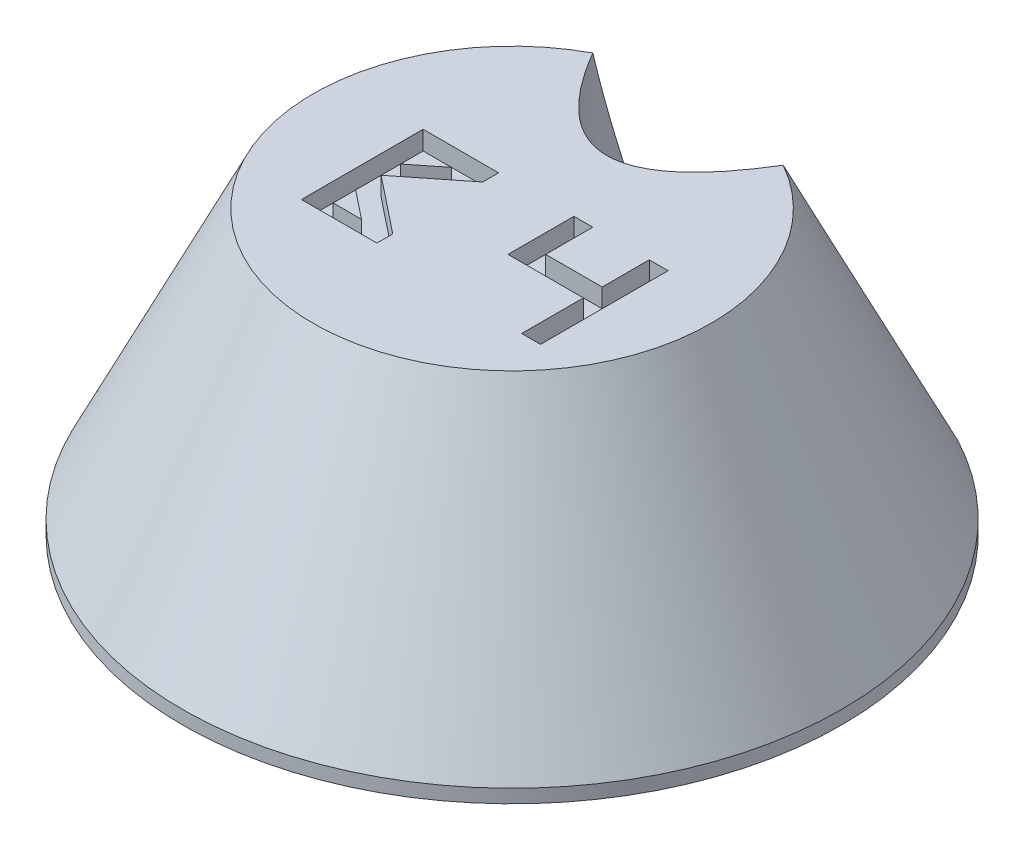
ISO-10303-21;
HEADER;
FILE_DESCRIPTION(('STEP AP214'),'2;1');
FILE_NAME('part.step','',(''),(''),'','','');
FILE_SCHEMA(('AUTOMOTIVE_DESIGN { 1 0 10303 214 1 1 1 1 }'));
ENDSEC;
DATA;
#1=APPLICATION_CONTEXT('core data for automotive mechanical design processes');
#2=APPLICATION_PROTOCOL_DEFINITION('international standard','automotive_design',2000,#1);
#3=PRODUCT_CONTEXT('',#1,'mechanical');
#4=PRODUCT('Part','Part','',(#3));
#5=PRODUCT_RELATED_PRODUCT_CATEGORY('part','',(#4));
#6=PRODUCT_DEFINITION_FORMATION('','',#4);
#7=PRODUCT_DEFINITION_CONTEXT('part definition',#1,'design');
#8=PRODUCT_DEFINITION('design','',#6,#7);
#9=PRODUCT_DEFINITION_SHAPE('','',#8);
#10=(LENGTH_UNIT() NAMED_UNIT(*) SI_UNIT(.MILLI.,.METRE.));
#11=(NAMED_UNIT(*) PLANE_ANGLE_UNIT() SI_UNIT($,.RADIAN.));
#12=(NAMED_UNIT(*) SI_UNIT($,.STERADIAN.) SOLID_ANGLE_UNIT());
#13=UNCERTAINTY_MEASURE_WITH_UNIT(LENGTH_MEASURE(1.E-05),#10,'distance_accuracy_value','');
#14=(GEOMETRIC_REPRESENTATION_CONTEXT(3) GLOBAL_UNCERTAINTY_ASSIGNED_CONTEXT((#13)) GLOBAL_UNIT_ASSIGNED_CONTEXT((#10,
#11,#12)) REPRESENTATION_CONTEXT('',''));
#15=CARTESIAN_POINT('',(0.,0.,0.));
#16=DIRECTION('',(0.,0.,1.));
#17=DIRECTION('',(1.,0.,0.));
#18=AXIS2_PLACEMENT_3D('',#15,#16,#17);
#19=CARTESIAN_POINT('',(8.18669170039506,15.,-15.4669996768178));
#20=CARTESIAN_POINT('',(-0.0591714163028373,15.,5.64885572999055));
#21=CARTESIAN_POINT('',(-7.8608991487024,15.,-15.6350972038529));
#22=B_SPLINE_CURVE_WITH_KNOTS('',2,(#19,#20,#21),.UNSPECIFIED.,.F.,.F.,(3,3),(0.,1.),.UNSPECIFIED.);
#23=DIRECTION('',(0.,-1.,0.));
#24=VECTOR('',#23,1.);
#25=SURFACE_OF_LINEAR_EXTRUSION('',#22,#24);
#26=CARTESIAN_POINT('',(-5.0098597989028,15.,-9.29821766200558));
#27=CARTESIAN_POINT('',(-5.07414422699931,14.7365281878771,-9.40894640558933));
#28=CARTESIAN_POINT('',(-5.13748485824235,14.4730441513829,-9.52018929222185));
#29=CARTESIAN_POINT('',(-5.26241635776587,13.9460659233518,-9.74362380865663));
#30=CARTESIAN_POINT('',(-5.32400724003735,13.682571731913,-9.85581543086348));
#31=CARTESIAN_POINT('',(-5.50635046744444,12.8921456425735,-10.1936725658184));
#32=CARTESIAN_POINT('',(-5.62468714212551,12.3652136301595,-10.4206441654586));
#33=CARTESIAN_POINT('',(-5.8557821905037,11.311426682589,-10.877540915263));
#34=CARTESIAN_POINT('',(-5.96854068442593,10.7845717460156,-11.1074660016367));
#35=CARTESIAN_POINT('',(-6.18911815550837,9.73115893426602,-11.5697626583082));
#36=CARTESIAN_POINT('',(-6.29693905529791,9.20460102368833,-11.8021332322681));
#37=CARTESIAN_POINT('',(-6.50824052110613,8.15157354006544,-12.2690676680501));
#38=CARTESIAN_POINT('',(-6.61172098512707,7.62510396938541,-12.5036315812561));
#39=CARTESIAN_POINT('',(-6.81479189522224,6.57226462240257,-12.9746601266114));
#40=CARTESIAN_POINT('',(-6.91438233339698,6.04589484630456,-13.2111247626193));
#41=CARTESIAN_POINT('',(-7.08663878740599,5.11920209503159,-13.628929150555));
#42=CARTESIAN_POINT('',(-7.16004479105935,4.71885860408437,-13.8099191742655));
#43=CARTESIAN_POINT('',(-7.30496649692964,3.91822939055515,-14.1727677090721));
#44=CARTESIAN_POINT('',(-7.37648222304347,3.51794366730654,-14.3546262091546));
#45=CARTESIAN_POINT('',(-7.51776759341717,2.71734004168838,-14.7191705229043));
#46=CARTESIAN_POINT('',(-7.58753687860065,2.31702214940516,-14.9018564977326));
#47=CARTESIAN_POINT('',(-7.72542676972131,1.51642804998791,-15.2679519216616));
#48=CARTESIAN_POINT('',(-7.79354735873456,1.11615184332374,-15.4513613781665));
#49=CARTESIAN_POINT('',(-7.8608991487024,0.715896693708777,-15.6350972038529));
#50=B_SPLINE_CURVE_WITH_KNOTS('',3,(#26,#27,#28,#29,#30,#31,#32,#33,#34,#35,#36,#37,#38,#39,#40,
#41,#42,#43,#44,#45,#46,#47,#48,#49),.UNSPECIFIED.,.F.,.F.,(4,2,2,2,2,2,2,2,2,2,2,4),(0.,
0.878799230708949,1.75759143255399,3.51498706846908,5.27234481116441,7.02901234167528,
8.78572112976651,10.5424334850327,11.8787619651716,13.2150735433558,14.551657653461,
15.8882554778523),.UNSPECIFIED.);
#51=CARTESIAN_POINT('',(-5.00985979890272,15.,-9.29821766200562));
#52=VERTEX_POINT('',#51);
#53=CARTESIAN_POINT('',(-7.8608991487024,0.715896693708777,-15.6350972038529));
#54=VERTEX_POINT('',#53);
#55=EDGE_CURVE('E492',#52,#54,#50,.T.);
#56=ORIENTED_EDGE('',*,*,#55,.F.);
#57=CARTESIAN_POINT('',(5.20353565699155,15.,-9.19123297284496));
#58=VERTEX_POINT('',#57);
#59=EDGE_CURVE('E538',#58,#52,#22,.T.);
#60=ORIENTED_EDGE('',*,*,#59,.F.);
#61=CARTESIAN_POINT('',(8.18669170039506,0.715896693708772,-15.4669996768178));
#62=CARTESIAN_POINT('',(8.10204818368061,1.19180990978793,-15.2502600316679));
#63=CARTESIAN_POINT('',(8.01633023885184,1.66775295008861,-15.0340026007232));
#64=CARTESIAN_POINT('',(7.84257005638052,2.61962131373132,-14.6026134017948));
#65=CARTESIAN_POINT('',(7.75452822889522,3.09554662554863,-14.3874814430946));
#66=CARTESIAN_POINT('',(7.57592886624524,4.04739672904643,-13.9584609297913));
#67=CARTESIAN_POINT('',(7.48537171535659,4.52332150981847,-13.7445721912288));
#68=CARTESIAN_POINT('',(7.3015144718489,5.47519061877045,-13.3181792758052));
#69=CARTESIAN_POINT('',(7.20821471309991,5.95113493758554,-13.1056749342314));
#70=CARTESIAN_POINT('',(7.01861055034016,6.90306652612799,-12.6822132865355));
#71=CARTESIAN_POINT('',(6.92230638966266,7.37905378927969,-12.4712558568261));
#72=CARTESIAN_POINT('',(6.72637390164977,8.3311556228556,-12.0510528752218));
#73=CARTESIAN_POINT('',(6.62674526541675,8.80727020100939,-11.8418074846651));
#74=CARTESIAN_POINT('',(6.42381233924976,9.75959112828457,-11.4252811289792));
#75=CARTESIAN_POINT('',(6.32050795985689,10.2357974793586,-11.2180002118162));
#76=CARTESIAN_POINT('',(6.10978444245751,11.188319486263,-10.8056747961175));
#77=CARTESIAN_POINT('',(6.00236495501761,11.6646351479467,-10.6006304894107));
#78=CARTESIAN_POINT('',(5.78288653496701,12.6173960379511,-10.1930946596617));
#79=CARTESIAN_POINT('',(5.67082679968787,13.0938412744059,-9.99060358624609));
#80=CARTESIAN_POINT('',(5.44135910215429,14.0468682643725,-9.58857748268586));
#81=CARTESIAN_POINT('',(5.32394952441522,14.5234500153549,-9.38904336987994));
#82=CARTESIAN_POINT('',(5.20353565699155,15.,-9.19123297284496));
#83=B_SPLINE_CURVE_WITH_KNOTS('',3,(#61,#62,#63,#64,#65,#66,#67,#68,#69,#70,#71,#72,#73,#74,#75,
#76,#77,#78,#79,#80,#81,#82),.UNSPECIFIED.,.F.,.F.,(4,2,2,2,2,2,2,2,2,2,4),(0.,1.58924738527902,
3.17821612514895,4.76694343281137,6.35547813197761,7.94388450447729,9.53243887888643,
11.1210319414337,12.7097601992866,14.2987644323033,15.8882517165116),.UNSPECIFIED.);
#84=CARTESIAN_POINT('',(8.18669170039507,0.715896693708777,-15.4669996768178));
#85=VERTEX_POINT('',#84);
#86=EDGE_CURVE('E484',#85,#58,#83,.T.);
#87=ORIENTED_EDGE('',*,*,#86,.F.);
#88=DIRECTION('',(0.,-1.,0.));
#89=VECTOR('',#88,1.);
#90=CARTESIAN_POINT('',(8.18669170039507,15.,-15.4669996768178));
#91=LINE('',#90,#89);
#92=CARTESIAN_POINT('',(8.18669170039507,0.,-15.4669996768178));
#93=VERTEX_POINT('',#92);
#94=EDGE_CURVE('E528',#85,#93,#91,.T.);
#95=ORIENTED_EDGE('',*,*,#94,.T.);
#96=CARTESIAN_POINT('',(8.18669170039506,0.,-15.4669996768178));
#97=CARTESIAN_POINT('',(-0.0591714163028373,0.,5.64885572999055));
#98=CARTESIAN_POINT('',(-7.8608991487024,0.,-15.6350972038529));
#99=B_SPLINE_CURVE_WITH_KNOTS('',2,(#96,#97,#98),.UNSPECIFIED.,.F.,.F.,(3,3),(0.,1.),.UNSPECIFIED.);
#100=CARTESIAN_POINT('',(-7.8608991487024,0.,-15.6350972038529));
#101=VERTEX_POINT('',#100);
#102=EDGE_CURVE('E535',#93,#101,#99,.T.);
#103=ORIENTED_EDGE('',*,*,#102,.T.);
#104=DIRECTION('',(0.,-1.,0.));
#105=VECTOR('',#104,1.);
#106=CARTESIAN_POINT('',(-7.8608991487024,15.,-15.6350972038529));
#107=LINE('',#106,#105);
#108=EDGE_CURVE('E55',#54,#101,#107,.T.);
#109=ORIENTED_EDGE('',*,*,#108,.F.);
#110=EDGE_LOOP('',(#56,#60,#87,#95,#103,#109));
#111=FACE_BOUND('',#110,.T.);
#112=ADVANCED_FACE('F45',(#111),#25,.F.);
#113=CARTESIAN_POINT('',(0.,15.,0.));
#114=DIRECTION('',(0.,-1.,0.));
#115=DIRECTION('',(0.,0.,-1.));
#116=AXIS2_PLACEMENT_3D('',#113,#114,#115);
#117=CYLINDRICAL_SURFACE('',#116,17.5);
#118=CARTESIAN_POINT('',(0.,0.715896693708777,0.));
#119=DIRECTION('',(0.,-1.,0.));
#120=DIRECTION('',(0.,0.,-1.));
#121=AXIS2_PLACEMENT_3D('',#118,#119,#120);
#122=CIRCLE('',#121,17.5);
#123=EDGE_CURVE('E355',#54,#85,#122,.F.);
#124=ORIENTED_EDGE('',*,*,#123,.F.);
#125=ORIENTED_EDGE('',*,*,#108,.T.);
#126=CARTESIAN_POINT('',(0.,0.,0.));
#127=DIRECTION('',(0.,1.,0.));
#128=DIRECTION('',(0.,0.,1.));
#129=AXIS2_PLACEMENT_3D('',#126,#127,#128);
#130=CIRCLE('',#129,17.5);
#131=EDGE_CURVE('E541',#101,#93,#130,.T.);
#132=ORIENTED_EDGE('',*,*,#131,.T.);
#133=ORIENTED_EDGE('',*,*,#94,.F.);
#134=EDGE_LOOP('',(#124,#125,#132,#133));
#135=FACE_BOUND('',#134,.T.);
#136=ADVANCED_FACE('F511',(#135),#117,.T.);
#137=CARTESIAN_POINT('',(0.0518624297717461,15.,-4.95109635517241));
#138=DIRECTION('',(0.,-1.,0.));
#139=DIRECTION('',(0.,0.,-1.));
#140=AXIS2_PLACEMENT_3D('',#137,#138,#139);
#141=PLANE('',#140);
#142=DIRECTION('',(0.,0.,1.));
#143=VECTOR('',#142,1.);
#144=CARTESIAN_POINT('',(-6.00797665984998,15.,-1.28369530117678));
#145=LINE('',#144,#143);
#146=CARTESIAN_POINT('',(-6.00797665984998,15.,-1.28369530117678));
#147=VERTEX_POINT('',#146);
#148=CARTESIAN_POINT('',(-6.00797665984998,15.,5.17749130671695));
#149=VERTEX_POINT('',#148);
#150=EDGE_CURVE('E329',#147,#149,#145,.T.);
#151=ORIENTED_EDGE('',*,*,#150,.F.);
#152=DIRECTION('',(-1.,0.,0.));
#153=VECTOR('',#152,1.);
#154=CARTESIAN_POINT('',(-2.00000000000039,15.,-1.28369530117678));
#155=LINE('',#154,#153);
#156=CARTESIAN_POINT('',(-2.00000000000039,15.,-1.28369530117678));
#157=VERTEX_POINT('',#156);
#158=EDGE_CURVE('E62',#157,#147,#155,.T.);
#159=ORIENTED_EDGE('',*,*,#158,.F.);
#160=DIRECTION('',(-4.63612313480528E-13,0.,-1.));
#161=VECTOR('',#160,1.);
#162=CARTESIAN_POINT('',(-2.,15.,-0.441800531030268));
#163=LINE('',#162,#161);
#164=CARTESIAN_POINT('',(-2.,15.,-0.441800531030268));
#165=VERTEX_POINT('',#164);
#166=EDGE_CURVE('E302',#165,#157,#163,.T.);
#167=ORIENTED_EDGE('',*,*,#166,.F.);
#168=DIRECTION('',(0.783109429204699,0.,-0.621883929596746));
#169=VECTOR('',#168,1.);
#170=CARTESIAN_POINT('',(-2.,15.,-0.441800531030268));
#171=LINE('',#170,#169);
#172=CARTESIAN_POINT('',(-5.00797665982377,15.,1.94689800277009));
#173=VERTEX_POINT('',#172);
#174=EDGE_CURVE('E345',#173,#165,#171,.T.);
#175=ORIENTED_EDGE('',*,*,#174,.F.);
#176=DIRECTION('',(-0.783109429204699,0.,-0.621883929596746));
#177=VECTOR('',#176,1.);
#178=CARTESIAN_POINT('',(-5.00797665982377,15.,1.94689800277009));
#179=LINE('',#178,#177);
#180=CARTESIAN_POINT('',(-2.,15.,4.33559653657044));
#181=VERTEX_POINT('',#180);
#182=EDGE_CURVE('E341',#181,#173,#179,.T.);
#183=ORIENTED_EDGE('',*,*,#182,.F.);
#184=DIRECTION('',(0.,0.,-1.));
#185=VECTOR('',#184,1.);
#186=CARTESIAN_POINT('',(-2.,15.,5.17749130671695));
#187=LINE('',#186,#185);
#188=CARTESIAN_POINT('',(-2.,15.,5.17749130671695));
#189=VERTEX_POINT('',#188);
#190=EDGE_CURVE('E337',#189,#181,#187,.T.);
#191=ORIENTED_EDGE('',*,*,#190,.F.);
#192=DIRECTION('',(1.,0.,0.));
#193=VECTOR('',#192,1.);
#194=CARTESIAN_POINT('',(-6.00797665984998,15.,5.17749130671695));
#195=LINE('',#194,#193);
#196=EDGE_CURVE('E333',#149,#189,#195,.T.);
#197=ORIENTED_EDGE('',*,*,#196,.F.);
#198=EDGE_LOOP('',(#151,#159,#167,#175,#183,#191,#197));
#199=FACE_BOUND('',#198,.T.);
#200=DIRECTION('',(1.,0.,0.));
#201=VECTOR('',#200,1.);
#202=CARTESIAN_POINT('',(5.99999999999733,15.,2.21630469885597));
#203=LINE('',#202,#201);
#204=CARTESIAN_POINT('',(1.99999999999733,15.,2.21630469885597));
#205=VERTEX_POINT('',#204);
#206=CARTESIAN_POINT('',(5.99999999999733,15.,2.21630469885597));
#207=VERTEX_POINT('',#206);
#208=EDGE_CURVE('E438',#205,#207,#203,.T.);
#209=ORIENTED_EDGE('',*,*,#208,.F.);
#210=DIRECTION('',(0.,0.,1.));
#211=VECTOR('',#210,1.);
#212=CARTESIAN_POINT('',(1.99999999999733,15.,2.21630469885597));
#213=LINE('',#212,#211);
#214=CARTESIAN_POINT('',(1.99999999999733,15.,-1.28369530117922));
#215=VERTEX_POINT('',#214);
#216=EDGE_CURVE('E259',#215,#205,#213,.T.);
#217=ORIENTED_EDGE('',*,*,#216,.F.);
#218=DIRECTION('',(-1.,0.,0.));
#219=VECTOR('',#218,1.);
#220=CARTESIAN_POINT('',(1.99999999999733,15.,-1.28369530117922));
#221=LINE('',#220,#219);
#222=CARTESIAN_POINT('',(2.99999999999733,15.,-1.28369530117922));
#223=VERTEX_POINT('',#222);
#224=EDGE_CURVE('E405',#223,#215,#221,.T.);
#225=ORIENTED_EDGE('',*,*,#224,.F.);
#226=DIRECTION('',(0.,0.,-1.));
#227=VECTOR('',#226,1.);
#228=CARTESIAN_POINT('',(2.99999999999733,15.,-1.28369530117922));
#229=LINE('',#228,#227);
#230=CARTESIAN_POINT('',(2.99999999999733,15.,1.21630469885597));
#231=VERTEX_POINT('',#230);
#232=EDGE_CURVE('E409',#231,#223,#229,.T.);
#233=ORIENTED_EDGE('',*,*,#232,.F.);
#234=DIRECTION('',(-1.,0.,0.));
#235=VECTOR('',#234,1.);
#236=CARTESIAN_POINT('',(2.99999999999733,15.,1.21630469885597));
#237=LINE('',#236,#235);
#238=CARTESIAN_POINT('',(5.99999999999733,15.,1.21630469885597));
#239=VERTEX_POINT('',#238);
#240=EDGE_CURVE('E414',#239,#231,#237,.T.);
#241=ORIENTED_EDGE('',*,*,#240,.F.);
#242=DIRECTION('',(0.,0.,1.));
#243=VECTOR('',#242,1.);
#244=CARTESIAN_POINT('',(5.99999999999733,15.,1.21630469885597));
#245=LINE('',#244,#243);
#246=CARTESIAN_POINT('',(5.99999999999733,15.,-1.28369530114403));
#247=VERTEX_POINT('',#246);
#248=EDGE_CURVE('E418',#247,#239,#245,.T.);
#249=ORIENTED_EDGE('',*,*,#248,.F.);
#250=DIRECTION('',(-1.,0.,0.));
#251=VECTOR('',#250,1.);
#252=CARTESIAN_POINT('',(5.99999999999733,15.,-1.28369530114403));
#253=LINE('',#252,#251);
#254=CARTESIAN_POINT('',(6.99999999999733,15.,-1.28369530114403));
#255=VERTEX_POINT('',#254);
#256=EDGE_CURVE('E422',#255,#247,#253,.T.);
#257=ORIENTED_EDGE('',*,*,#256,.F.);
#258=DIRECTION('',(0.,0.,-1.));
#259=VECTOR('',#258,1.);
#260=CARTESIAN_POINT('',(6.99999999999733,15.,-1.28369530114403));
#261=LINE('',#260,#259);
#262=CARTESIAN_POINT('',(6.99999999999733,15.,5.49370176646922));
#263=VERTEX_POINT('',#262);
#264=EDGE_CURVE('E426',#263,#255,#261,.T.);
#265=ORIENTED_EDGE('',*,*,#264,.F.);
#266=DIRECTION('',(1.,0.,0.));
#267=VECTOR('',#266,1.);
#268=CARTESIAN_POINT('',(6.99999999999733,15.,5.49370176646922));
#269=LINE('',#268,#267);
#270=CARTESIAN_POINT('',(5.99999999999733,15.,5.49370176646922));
#271=VERTEX_POINT('',#270);
#272=EDGE_CURVE('E430',#271,#263,#269,.T.);
#273=ORIENTED_EDGE('',*,*,#272,.F.);
#274=DIRECTION('',(0.,0.,1.));
#275=VECTOR('',#274,1.);
#276=CARTESIAN_POINT('',(5.99999999999733,15.,5.49370176646922));
#277=LINE('',#276,#275);
#278=EDGE_CURVE('E434',#207,#271,#277,.T.);
#279=ORIENTED_EDGE('',*,*,#278,.F.);
#280=EDGE_LOOP('',(#209,#217,#225,#233,#241,#249,#257,#265,#273,#279));
#281=FACE_BOUND('',#280,.T.);
#282=ORIENTED_EDGE('',*,*,#59,.T.);
#283=CARTESIAN_POINT('',(0.,15.,0.));
#284=DIRECTION('',(0.,-1.,0.));
#285=DIRECTION('',(0.,0.,-1.));
#286=AXIS2_PLACEMENT_3D('',#283,#284,#285);
#287=CIRCLE('',#286,10.5619859351684);
#288=EDGE_CURVE('E11',#52,#58,#287,.F.);
#289=ORIENTED_EDGE('',*,*,#288,.T.);
#290=EDGE_LOOP('',(#282,#289));
#291=FACE_BOUND('',#290,.T.);
#292=ADVANCED_FACE('F507',(#199,#281,#291),#141,.F.);
#293=CARTESIAN_POINT('',(0.0518624297717461,0.,-4.95109635517241));
#294=DIRECTION('',(0.,-1.,0.));
#295=DIRECTION('',(0.,0.,-1.));
#296=AXIS2_PLACEMENT_3D('',#293,#294,#295);
#297=PLANE('',#296);
#298=ORIENTED_EDGE('',*,*,#102,.F.);
#299=ORIENTED_EDGE('',*,*,#131,.F.);
#300=EDGE_LOOP('',(#298,#299));
#301=FACE_BOUND('',#300,.T.);
#302=ADVANCED_FACE('F503',(#301),#297,.T.);
#303=CARTESIAN_POINT('',(0.,15.,0.));
#304=DIRECTION('',(0.,-1.,0.));
#305=DIRECTION('',(0.,0.,-1.));
#306=AXIS2_PLACEMENT_3D('',#303,#304,#305);
#307=CONICAL_SURFACE('',#306,10.5619859351684,0.452155053537177);
#308=ORIENTED_EDGE('',*,*,#55,.T.);
#309=ORIENTED_EDGE('',*,*,#123,.T.);
#310=ORIENTED_EDGE('',*,*,#86,.T.);
#311=ORIENTED_EDGE('',*,*,#288,.F.);
#312=EDGE_LOOP('',(#308,#309,#310,#311));
#313=FACE_BOUND('',#312,.T.);
#314=ADVANCED_FACE('F497',(#313),#307,.T.);
#315=CARTESIAN_POINT('',(1.99999999999733,14.,2.21630469885597));
#316=DIRECTION('',(-1.,0.,0.));
#317=DIRECTION('',(0.,0.,1.));
#318=AXIS2_PLACEMENT_3D('',#315,#316,#317);
#319=PLANE('',#318);
#320=ORIENTED_EDGE('',*,*,#216,.T.);
#321=DIRECTION('',(0.,1.,0.));
#322=VECTOR('',#321,1.);
#323=CARTESIAN_POINT('',(1.99999999999733,14.,2.21630469885597));
#324=LINE('',#323,#322);
#325=CARTESIAN_POINT('',(1.99999999999733,14.,2.21630469885597));
#326=VERTEX_POINT('',#325);
#327=EDGE_CURVE('E373',#326,#205,#324,.T.);
#328=ORIENTED_EDGE('',*,*,#327,.F.);
#329=DIRECTION('',(0.,0.,1.));
#330=VECTOR('',#329,1.);
#331=CARTESIAN_POINT('',(1.99999999999733,14.,2.21630469885597));
#332=LINE('',#331,#330);
#333=CARTESIAN_POINT('',(1.99999999999733,14.,-1.28369530117922));
#334=VERTEX_POINT('',#333);
#335=EDGE_CURVE('E410',#334,#326,#332,.T.);
#336=ORIENTED_EDGE('',*,*,#335,.F.);
#337=DIRECTION('',(0.,1.,0.));
#338=VECTOR('',#337,1.);
#339=CARTESIAN_POINT('',(1.99999999999733,14.,-1.28369530117922));
#340=LINE('',#339,#338);
#341=EDGE_CURVE('E402',#334,#215,#340,.T.);
#342=ORIENTED_EDGE('',*,*,#341,.T.);
#343=EDGE_LOOP('',(#320,#328,#336,#342));
#344=FACE_BOUND('',#343,.T.);
#345=ADVANCED_FACE('F502',(#344),#319,.F.);
#346=CARTESIAN_POINT('',(1.99999999999733,14.,-1.28369530117922));
#347=DIRECTION('',(0.,0.,-1.));
#348=DIRECTION('',(-1.,0.,0.));
#349=AXIS2_PLACEMENT_3D('',#346,#347,#348);
#350=PLANE('',#349);
#351=ORIENTED_EDGE('',*,*,#224,.T.);
#352=ORIENTED_EDGE('',*,*,#341,.F.);
#353=DIRECTION('',(-1.,0.,0.));
#354=VECTOR('',#353,1.);
#355=CARTESIAN_POINT('',(1.99999999999733,14.,-1.28369530117922));
#356=LINE('',#355,#354);
#357=CARTESIAN_POINT('',(2.99999999999733,14.,-1.28369530117922));
#358=VERTEX_POINT('',#357);
#359=EDGE_CURVE('E377',#358,#334,#356,.T.);
#360=ORIENTED_EDGE('',*,*,#359,.F.);
#361=DIRECTION('',(0.,1.,0.));
#362=VECTOR('',#361,1.);
#363=CARTESIAN_POINT('',(2.99999999999733,14.,-1.28369530117922));
#364=LINE('',#363,#362);
#365=EDGE_CURVE('E399',#358,#223,#364,.T.);
#366=ORIENTED_EDGE('',*,*,#365,.T.);
#367=EDGE_LOOP('',(#351,#352,#360,#366));
#368=FACE_BOUND('',#367,.T.);
#369=ADVANCED_FACE('F604',(#368),#350,.F.);
#370=CARTESIAN_POINT('',(2.99999999999733,14.,-1.28369530117922));
#371=DIRECTION('',(1.,0.,0.));
#372=DIRECTION('',(0.,0.,-1.));
#373=AXIS2_PLACEMENT_3D('',#370,#371,#372);
#374=PLANE('',#373);
#375=ORIENTED_EDGE('',*,*,#232,.T.);
#376=ORIENTED_EDGE('',*,*,#365,.F.);
#377=DIRECTION('',(0.,0.,-1.));
#378=VECTOR('',#377,1.);
#379=CARTESIAN_POINT('',(2.99999999999733,14.,-1.28369530117922));
#380=LINE('',#379,#378);
#381=CARTESIAN_POINT('',(2.99999999999733,14.,1.21630469885597));
#382=VERTEX_POINT('',#381);
#383=EDGE_CURVE('E447',#382,#358,#380,.T.);
#384=ORIENTED_EDGE('',*,*,#383,.F.);
#385=DIRECTION('',(0.,1.,0.));
#386=VECTOR('',#385,1.);
#387=CARTESIAN_POINT('',(2.99999999999733,14.,1.21630469885597));
#388=LINE('',#387,#386);
#389=EDGE_CURVE('E396',#382,#231,#388,.T.);
#390=ORIENTED_EDGE('',*,*,#389,.T.);
#391=EDGE_LOOP('',(#375,#376,#384,#390));
#392=FACE_BOUND('',#391,.T.);
#393=ADVANCED_FACE('F613',(#392),#374,.F.);
#394=CARTESIAN_POINT('',(2.99999999999733,14.,1.21630469885597));
#395=DIRECTION('',(0.,0.,-1.));
#396=DIRECTION('',(-1.,0.,0.));
#397=AXIS2_PLACEMENT_3D('',#394,#395,#396);
#398=PLANE('',#397);
#399=ORIENTED_EDGE('',*,*,#240,.T.);
#400=ORIENTED_EDGE('',*,*,#389,.F.);
#401=DIRECTION('',(-1.,0.,0.));
#402=VECTOR('',#401,1.);
#403=CARTESIAN_POINT('',(2.99999999999733,14.,1.21630469885597));
#404=LINE('',#403,#402);
#405=CARTESIAN_POINT('',(5.99999999999733,14.,1.21630469885597));
#406=VERTEX_POINT('',#405);
#407=EDGE_CURVE('E451',#406,#382,#404,.T.);
#408=ORIENTED_EDGE('',*,*,#407,.F.);
#409=DIRECTION('',(0.,1.,0.));
#410=VECTOR('',#409,1.);
#411=CARTESIAN_POINT('',(5.99999999999733,14.,1.21630469885597));
#412=LINE('',#411,#410);
#413=EDGE_CURVE('E393',#406,#239,#412,.T.);
#414=ORIENTED_EDGE('',*,*,#413,.T.);
#415=EDGE_LOOP('',(#399,#400,#408,#414));
#416=FACE_BOUND('',#415,.T.);
#417=ADVANCED_FACE('F621',(#416),#398,.F.);
#418=CARTESIAN_POINT('',(5.99999999999733,14.,1.21630469885597));
#419=DIRECTION('',(-1.,0.,0.));
#420=DIRECTION('',(0.,0.,1.));
#421=AXIS2_PLACEMENT_3D('',#418,#419,#420);
#422=PLANE('',#421);
#423=ORIENTED_EDGE('',*,*,#248,.T.);
#424=ORIENTED_EDGE('',*,*,#413,.F.);
#425=DIRECTION('',(0.,0.,1.));
#426=VECTOR('',#425,1.);
#427=CARTESIAN_POINT('',(5.99999999999733,14.,1.21630469885597));
#428=LINE('',#427,#426);
#429=CARTESIAN_POINT('',(5.99999999999733,14.,-1.28369530114403));
#430=VERTEX_POINT('',#429);
#431=EDGE_CURVE('E455',#430,#406,#428,.T.);
#432=ORIENTED_EDGE('',*,*,#431,.F.);
#433=DIRECTION('',(0.,1.,0.));
#434=VECTOR('',#433,1.);
#435=CARTESIAN_POINT('',(5.99999999999733,14.,-1.28369530114403));
#436=LINE('',#435,#434);
#437=EDGE_CURVE('E390',#430,#247,#436,.T.);
#438=ORIENTED_EDGE('',*,*,#437,.T.);
#439=EDGE_LOOP('',(#423,#424,#432,#438));
#440=FACE_BOUND('',#439,.T.);
#441=ADVANCED_FACE('F630',(#440),#422,.F.);
#442=CARTESIAN_POINT('',(5.99999999999733,14.,-1.28369530114403));
#443=DIRECTION('',(0.,0.,-1.));
#444=DIRECTION('',(-1.,0.,0.));
#445=AXIS2_PLACEMENT_3D('',#442,#443,#444);
#446=PLANE('',#445);
#447=ORIENTED_EDGE('',*,*,#256,.T.);
#448=ORIENTED_EDGE('',*,*,#437,.F.);
#449=DIRECTION('',(-1.,0.,0.));
#450=VECTOR('',#449,1.);
#451=CARTESIAN_POINT('',(5.99999999999733,14.,-1.28369530114403));
#452=LINE('',#451,#450);
#453=CARTESIAN_POINT('',(6.99999999999733,14.,-1.28369530114403));
#454=VERTEX_POINT('',#453);
#455=EDGE_CURVE('E459',#454,#430,#452,.T.);
#456=ORIENTED_EDGE('',*,*,#455,.F.);
#457=DIRECTION('',(0.,1.,0.));
#458=VECTOR('',#457,1.);
#459=CARTESIAN_POINT('',(6.99999999999733,14.,-1.28369530114403));
#460=LINE('',#459,#458);
#461=EDGE_CURVE('E387',#454,#255,#460,.T.);
#462=ORIENTED_EDGE('',*,*,#461,.T.);
#463=EDGE_LOOP('',(#447,#448,#456,#462));
#464=FACE_BOUND('',#463,.T.);
#465=ADVANCED_FACE('F639',(#464),#446,.F.);
#466=CARTESIAN_POINT('',(6.99999999999733,14.,-1.28369530114403));
#467=DIRECTION('',(1.,0.,0.));
#468=DIRECTION('',(0.,0.,-1.));
#469=AXIS2_PLACEMENT_3D('',#466,#467,#468);
#470=PLANE('',#469);
#471=ORIENTED_EDGE('',*,*,#264,.T.);
#472=ORIENTED_EDGE('',*,*,#461,.F.);
#473=DIRECTION('',(0.,0.,-1.));
#474=VECTOR('',#473,1.);
#475=CARTESIAN_POINT('',(6.99999999999733,14.,-1.28369530114403));
#476=LINE('',#475,#474);
#477=CARTESIAN_POINT('',(6.99999999999733,14.,5.49370176646922));
#478=VERTEX_POINT('',#477);
#479=EDGE_CURVE('E463',#478,#454,#476,.T.);
#480=ORIENTED_EDGE('',*,*,#479,.F.);
#481=DIRECTION('',(0.,1.,0.));
#482=VECTOR('',#481,1.);
#483=CARTESIAN_POINT('',(6.99999999999733,14.,5.49370176646922));
#484=LINE('',#483,#482);
#485=EDGE_CURVE('E384',#478,#263,#484,.T.);
#486=ORIENTED_EDGE('',*,*,#485,.T.);
#487=EDGE_LOOP('',(#471,#472,#480,#486));
#488=FACE_BOUND('',#487,.T.);
#489=ADVANCED_FACE('F648',(#488),#470,.F.);
#490=CARTESIAN_POINT('',(6.99999999999733,14.,5.49370176646922));
#491=DIRECTION('',(0.,0.,1.));
#492=DIRECTION('',(1.,0.,0.));
#493=AXIS2_PLACEMENT_3D('',#490,#491,#492);
#494=PLANE('',#493);
#495=ORIENTED_EDGE('',*,*,#272,.T.);
#496=ORIENTED_EDGE('',*,*,#485,.F.);
#497=DIRECTION('',(1.,0.,0.));
#498=VECTOR('',#497,1.);
#499=CARTESIAN_POINT('',(6.99999999999733,14.,5.49370176646922));
#500=LINE('',#499,#498);
#501=CARTESIAN_POINT('',(5.99999999999733,14.,5.49370176646922));
#502=VERTEX_POINT('',#501);
#503=EDGE_CURVE('E467',#502,#478,#500,.T.);
#504=ORIENTED_EDGE('',*,*,#503,.F.);
#505=DIRECTION('',(0.,1.,0.));
#506=VECTOR('',#505,1.);
#507=CARTESIAN_POINT('',(5.99999999999733,14.,5.49370176646922));
#508=LINE('',#507,#506);
#509=EDGE_CURVE('E381',#502,#271,#508,.T.);
#510=ORIENTED_EDGE('',*,*,#509,.T.);
#511=EDGE_LOOP('',(#495,#496,#504,#510));
#512=FACE_BOUND('',#511,.T.);
#513=ADVANCED_FACE('F657',(#512),#494,.F.);
#514=CARTESIAN_POINT('',(5.99999999999733,14.,5.49370176646922));
#515=DIRECTION('',(-1.,0.,0.));
#516=DIRECTION('',(0.,0.,1.));
#517=AXIS2_PLACEMENT_3D('',#514,#515,#516);
#518=PLANE('',#517);
#519=ORIENTED_EDGE('',*,*,#278,.T.);
#520=ORIENTED_EDGE('',*,*,#509,.F.);
#521=DIRECTION('',(0.,0.,1.));
#522=VECTOR('',#521,1.);
#523=CARTESIAN_POINT('',(5.99999999999733,14.,5.49370176646922));
#524=LINE('',#523,#522);
#525=CARTESIAN_POINT('',(5.99999999999733,14.,2.21630469885597));
#526=VERTEX_POINT('',#525);
#527=EDGE_CURVE('E471',#526,#502,#524,.T.);
#528=ORIENTED_EDGE('',*,*,#527,.F.);
#529=DIRECTION('',(0.,1.,0.));
#530=VECTOR('',#529,1.);
#531=CARTESIAN_POINT('',(5.99999999999733,14.,2.21630469885597));
#532=LINE('',#531,#530);
#533=EDGE_CURVE('E378',#526,#207,#532,.T.);
#534=ORIENTED_EDGE('',*,*,#533,.T.);
#535=EDGE_LOOP('',(#519,#520,#528,#534));
#536=FACE_BOUND('',#535,.T.);
#537=ADVANCED_FACE('F666',(#536),#518,.F.);
#538=CARTESIAN_POINT('',(5.99999999999733,14.,2.21630469885597));
#539=DIRECTION('',(0.,0.,1.));
#540=DIRECTION('',(1.,0.,0.));
#541=AXIS2_PLACEMENT_3D('',#538,#539,#540);
#542=PLANE('',#541);
#543=ORIENTED_EDGE('',*,*,#208,.T.);
#544=ORIENTED_EDGE('',*,*,#533,.F.);
#545=DIRECTION('',(1.,0.,0.));
#546=VECTOR('',#545,1.);
#547=CARTESIAN_POINT('',(5.99999999999733,14.,2.21630469885597));
#548=LINE('',#547,#546);
#549=EDGE_CURVE('E475',#326,#526,#548,.T.);
#550=ORIENTED_EDGE('',*,*,#549,.F.);
#551=ORIENTED_EDGE('',*,*,#327,.T.);
#552=EDGE_LOOP('',(#543,#544,#550,#551));
#553=FACE_BOUND('',#552,.T.);
#554=ADVANCED_FACE('F675',(#553),#542,.F.);
#555=CARTESIAN_POINT('',(0.,14.,0.));
#556=DIRECTION('',(0.,-1.,0.));
#557=DIRECTION('',(0.,0.,-1.));
#558=AXIS2_PLACEMENT_3D('',#555,#556,#557);
#559=PLANE('',#558);
#560=ORIENTED_EDGE('',*,*,#335,.T.);
#561=ORIENTED_EDGE('',*,*,#549,.T.);
#562=ORIENTED_EDGE('',*,*,#527,.T.);
#563=ORIENTED_EDGE('',*,*,#503,.T.);
#564=ORIENTED_EDGE('',*,*,#479,.T.);
#565=ORIENTED_EDGE('',*,*,#455,.T.);
#566=ORIENTED_EDGE('',*,*,#431,.T.);
#567=ORIENTED_EDGE('',*,*,#407,.T.);
#568=ORIENTED_EDGE('',*,*,#383,.T.);
#569=ORIENTED_EDGE('',*,*,#359,.T.);
#570=EDGE_LOOP('',(#560,#561,#562,#563,#564,#565,#566,#567,#568,#569));
#571=FACE_BOUND('',#570,.T.);
#572=ADVANCED_FACE('F505',(#571),#559,.F.);
#573=CARTESIAN_POINT('',(-2.00000000000039,14.,-1.28369530117678));
#574=DIRECTION('',(0.,0.,-1.));
#575=DIRECTION('',(-1.,0.,0.));
#576=AXIS2_PLACEMENT_3D('',#573,#574,#575);
#577=PLANE('',#576);
#578=ORIENTED_EDGE('',*,*,#158,.T.);
#579=DIRECTION('',(0.,1.,0.));
#580=VECTOR('',#579,1.);
#581=CARTESIAN_POINT('',(-6.00797665984998,14.,-1.28369530117678));
#582=LINE('',#581,#580);
#583=CARTESIAN_POINT('',(-6.00797665984998,14.,-1.28369530117678));
#584=VERTEX_POINT('',#583);
#585=EDGE_CURVE('E326',#584,#147,#582,.T.);
#586=ORIENTED_EDGE('',*,*,#585,.F.);
#587=DIRECTION('',(-1.,0.,0.));
#588=VECTOR('',#587,1.);
#589=CARTESIAN_POINT('',(-2.00000000000039,14.,-1.28369530117678));
#590=LINE('',#589,#588);
#591=CARTESIAN_POINT('',(-2.00000000000039,14.,-1.28369530117678));
#592=VERTEX_POINT('',#591);
#593=EDGE_CURVE('E297',#592,#584,#590,.T.);
#594=ORIENTED_EDGE('',*,*,#593,.F.);
#595=DIRECTION('',(0.,1.,0.));
#596=VECTOR('',#595,1.);
#597=CARTESIAN_POINT('',(-2.00000000000039,14.,-1.28369530117678));
#598=LINE('',#597,#596);
#599=EDGE_CURVE('E352',#592,#157,#598,.T.);
#600=ORIENTED_EDGE('',*,*,#599,.T.);
#601=EDGE_LOOP('',(#578,#586,#594,#600));
#602=FACE_BOUND('',#601,.T.);
#603=ADVANCED_FACE('F692',(#602),#577,.F.);
#604=CARTESIAN_POINT('',(-2.,14.,-0.441800531030268));
#605=DIRECTION('',(1.,0.,-4.63612313480528E-13));
#606=DIRECTION('',(-4.63612313480528E-13,0.,-1.));
#607=AXIS2_PLACEMENT_3D('',#604,#605,#606);
#608=PLANE('',#607);
#609=ORIENTED_EDGE('',*,*,#166,.T.);
#610=ORIENTED_EDGE('',*,*,#599,.F.);
#611=DIRECTION('',(-4.63612313480528E-13,0.,-1.));
#612=VECTOR('',#611,1.);
#613=CARTESIAN_POINT('',(-2.,14.,-0.441800531030268));
#614=LINE('',#613,#612);
#615=CARTESIAN_POINT('',(-2.,14.,-0.441800531030268));
#616=VERTEX_POINT('',#615);
#617=EDGE_CURVE('E322',#616,#592,#614,.T.);
#618=ORIENTED_EDGE('',*,*,#617,.F.);
#619=DIRECTION('',(0.,1.,0.));
#620=VECTOR('',#619,1.);
#621=CARTESIAN_POINT('',(-2.,14.,-0.441800531030268));
#622=LINE('',#621,#620);
#623=EDGE_CURVE('E356',#616,#165,#622,.T.);
#624=ORIENTED_EDGE('',*,*,#623,.T.);
#625=EDGE_LOOP('',(#609,#610,#618,#624));
#626=FACE_BOUND('',#625,.T.);
#627=ADVANCED_FACE('F700',(#626),#608,.F.);
#628=CARTESIAN_POINT('',(-2.,14.,-0.441800531030268));
#629=DIRECTION('',(0.621883929596746,0.,0.783109429204699));
#630=DIRECTION('',(0.783109429204699,0.,-0.621883929596746));
#631=AXIS2_PLACEMENT_3D('',#628,#629,#630);
#632=PLANE('',#631);
#633=ORIENTED_EDGE('',*,*,#174,.T.);
#634=ORIENTED_EDGE('',*,*,#623,.F.);
#635=DIRECTION('',(0.783109429204699,0.,-0.621883929596746));
#636=VECTOR('',#635,1.);
#637=CARTESIAN_POINT('',(-2.,14.,-0.441800531030268));
#638=LINE('',#637,#636);
#639=CARTESIAN_POINT('',(-5.00797665982377,14.,1.94689800277009));
#640=VERTEX_POINT('',#639);
#641=EDGE_CURVE('E318',#640,#616,#638,.T.);
#642=ORIENTED_EDGE('',*,*,#641,.F.);
#643=DIRECTION('',(0.,1.,0.));
#644=VECTOR('',#643,1.);
#645=CARTESIAN_POINT('',(-5.00797665982377,14.,1.94689800277009));
#646=LINE('',#645,#644);
#647=EDGE_CURVE('E359',#640,#173,#646,.T.);
#648=ORIENTED_EDGE('',*,*,#647,.T.);
#649=EDGE_LOOP('',(#633,#634,#642,#648));
#650=FACE_BOUND('',#649,.T.);
#651=ADVANCED_FACE('F708',(#650),#632,.F.);
#652=CARTESIAN_POINT('',(-5.00797665982377,14.,1.94689800277009));
#653=DIRECTION('',(0.621883929596746,0.,-0.783109429204699));
#654=DIRECTION('',(-0.783109429204699,0.,-0.621883929596746));
#655=AXIS2_PLACEMENT_3D('',#652,#653,#654);
#656=PLANE('',#655);
#657=ORIENTED_EDGE('',*,*,#182,.T.);
#658=ORIENTED_EDGE('',*,*,#647,.F.);
#659=DIRECTION('',(-0.783109429204699,0.,-0.621883929596746));
#660=VECTOR('',#659,1.);
#661=CARTESIAN_POINT('',(-5.00797665982377,14.,1.94689800277009));
#662=LINE('',#661,#660);
#663=CARTESIAN_POINT('',(-2.,14.,4.33559653657044));
#664=VERTEX_POINT('',#663);
#665=EDGE_CURVE('E314',#664,#640,#662,.T.);
#666=ORIENTED_EDGE('',*,*,#665,.F.);
#667=DIRECTION('',(0.,1.,0.));
#668=VECTOR('',#667,1.);
#669=CARTESIAN_POINT('',(-2.,14.,4.33559653657044));
#670=LINE('',#669,#668);
#671=EDGE_CURVE('E362',#664,#181,#670,.T.);
#672=ORIENTED_EDGE('',*,*,#671,.T.);
#673=EDGE_LOOP('',(#657,#658,#666,#672));
#674=FACE_BOUND('',#673,.T.);
#675=ADVANCED_FACE('F717',(#674),#656,.F.);
#676=CARTESIAN_POINT('',(-2.,14.,5.17749130671695));
#677=DIRECTION('',(1.,0.,0.));
#678=DIRECTION('',(0.,0.,-1.));
#679=AXIS2_PLACEMENT_3D('',#676,#677,#678);
#680=PLANE('',#679);
#681=ORIENTED_EDGE('',*,*,#190,.T.);
#682=ORIENTED_EDGE('',*,*,#671,.F.);
#683=DIRECTION('',(0.,0.,-1.));
#684=VECTOR('',#683,1.);
#685=CARTESIAN_POINT('',(-2.,14.,5.17749130671695));
#686=LINE('',#685,#684);
#687=CARTESIAN_POINT('',(-2.,14.,5.17749130671695));
#688=VERTEX_POINT('',#687);
#689=EDGE_CURVE('E310',#688,#664,#686,.T.);
#690=ORIENTED_EDGE('',*,*,#689,.F.);
#691=DIRECTION('',(0.,1.,0.));
#692=VECTOR('',#691,1.);
#693=CARTESIAN_POINT('',(-2.,14.,5.17749130671695));
#694=LINE('',#693,#692);
#695=EDGE_CURVE('E365',#688,#189,#694,.T.);
#696=ORIENTED_EDGE('',*,*,#695,.T.);
#697=EDGE_LOOP('',(#681,#682,#690,#696));
#698=FACE_BOUND('',#697,.T.);
#699=ADVANCED_FACE('F726',(#698),#680,.F.);
#700=CARTESIAN_POINT('',(-6.00797665984998,14.,5.17749130671695));
#701=DIRECTION('',(0.,0.,1.));
#702=DIRECTION('',(1.,0.,0.));
#703=AXIS2_PLACEMENT_3D('',#700,#701,#702);
#704=PLANE('',#703);
#705=ORIENTED_EDGE('',*,*,#196,.T.);
#706=ORIENTED_EDGE('',*,*,#695,.F.);
#707=DIRECTION('',(1.,0.,0.));
#708=VECTOR('',#707,1.);
#709=CARTESIAN_POINT('',(-6.00797665984998,14.,5.17749130671695));
#710=LINE('',#709,#708);
#711=CARTESIAN_POINT('',(-6.00797665984998,14.,5.17749130671695));
#712=VERTEX_POINT('',#711);
#713=EDGE_CURVE('E306',#712,#688,#710,.T.);
#714=ORIENTED_EDGE('',*,*,#713,.F.);
#715=DIRECTION('',(0.,1.,0.));
#716=VECTOR('',#715,1.);
#717=CARTESIAN_POINT('',(-6.00797665984998,14.,5.17749130671695));
#718=LINE('',#717,#716);
#719=EDGE_CURVE('E368',#712,#149,#718,.T.);
#720=ORIENTED_EDGE('',*,*,#719,.T.);
#721=EDGE_LOOP('',(#705,#706,#714,#720));
#722=FACE_BOUND('',#721,.T.);
#723=ADVANCED_FACE('F735',(#722),#704,.F.);
#724=CARTESIAN_POINT('',(-6.00797665984998,14.,-1.28369530117678));
#725=DIRECTION('',(-1.,0.,0.));
#726=DIRECTION('',(0.,0.,1.));
#727=AXIS2_PLACEMENT_3D('',#724,#725,#726);
#728=PLANE('',#727);
#729=ORIENTED_EDGE('',*,*,#150,.T.);
#730=ORIENTED_EDGE('',*,*,#719,.F.);
#731=DIRECTION('',(0.,0.,1.));
#732=VECTOR('',#731,1.);
#733=CARTESIAN_POINT('',(-6.00797665984998,14.,-1.28369530117678));
#734=LINE('',#733,#732);
#735=EDGE_CURVE('E301',#584,#712,#734,.T.);
#736=ORIENTED_EDGE('',*,*,#735,.F.);
#737=ORIENTED_EDGE('',*,*,#585,.T.);
#738=EDGE_LOOP('',(#729,#730,#736,#737));
#739=FACE_BOUND('',#738,.T.);
#740=ADVANCED_FACE('F744',(#739),#728,.F.);
#741=CARTESIAN_POINT('',(0.,14.,0.));
#742=DIRECTION('',(0.,1.,0.));
#743=DIRECTION('',(0.,0.,1.));
#744=AXIS2_PLACEMENT_3D('',#741,#742,#743);
#745=PLANE('',#744);
#746=DIRECTION('',(-1.,0.,0.));
#747=VECTOR('',#746,1.);
#748=CARTESIAN_POINT('',(-5.00797665984998,14.,-0.283695301176779));
#749=LINE('',#748,#747);
#750=CARTESIAN_POINT('',(-3.5039883299381,14.,-0.28369530117678));
#751=VERTEX_POINT('',#750);
#752=CARTESIAN_POINT('',(-5.00797665984998,14.,-0.283695301176779));
#753=VERTEX_POINT('',#752);
#754=EDGE_CURVE('E234',#751,#753,#749,.T.);
#755=ORIENTED_EDGE('',*,*,#754,.F.);
#756=DIRECTION('',(0.783109429204989,0.,-0.621883929596381));
#757=VECTOR('',#756,1.);
#758=CARTESIAN_POINT('',(-5.00797665985054,14.,0.910653965722697));
#759=LINE('',#758,#757);
#760=CARTESIAN_POINT('',(-5.00797665985054,14.,0.910653965722697));
#761=VERTEX_POINT('',#760);
#762=EDGE_CURVE('E225',#761,#751,#759,.T.);
#763=ORIENTED_EDGE('',*,*,#762,.F.);
#764=DIRECTION('',(-4.66960220919602E-13,0.,1.));
#765=VECTOR('',#764,1.);
#766=CARTESIAN_POINT('',(-5.00797665985054,14.,0.910653965722697));
#767=LINE('',#766,#765);
#768=EDGE_CURVE('E240',#753,#761,#767,.T.);
#769=ORIENTED_EDGE('',*,*,#768,.F.);
#770=EDGE_LOOP('',(#755,#763,#769));
#771=FACE_BOUND('',#770,.T.);
#772=DIRECTION('',(-0.7831094292047,0.,-0.621883929596744));
#773=VECTOR('',#772,1.);
#774=CARTESIAN_POINT('',(-3.5039883299381,14.,4.49370176642393));
#775=LINE('',#774,#773);
#776=CARTESIAN_POINT('',(-3.5039883299381,14.,4.49370176642393));
#777=VERTEX_POINT('',#776);
#778=CARTESIAN_POINT('',(-5.00797665984998,14.,3.29935249952376));
#779=VERTEX_POINT('',#778);
#780=EDGE_CURVE('E275',#777,#779,#775,.T.);
#781=ORIENTED_EDGE('',*,*,#780,.F.);
#782=DIRECTION('',(1.,0.,0.));
#783=VECTOR('',#782,1.);
#784=CARTESIAN_POINT('',(-3.5039883299381,14.,4.49370176642393));
#785=LINE('',#784,#783);
#786=CARTESIAN_POINT('',(-5.00797665984998,14.,4.49370176642393));
#787=VERTEX_POINT('',#786);
#788=EDGE_CURVE('E271',#787,#777,#785,.T.);
#789=ORIENTED_EDGE('',*,*,#788,.F.);
#790=DIRECTION('',(0.,0.,1.));
#791=VECTOR('',#790,1.);
#792=CARTESIAN_POINT('',(-5.00797665984998,14.,4.49370176642393));
#793=LINE('',#792,#791);
#794=EDGE_CURVE('E267',#779,#787,#793,.T.);
#795=ORIENTED_EDGE('',*,*,#794,.F.);
#796=EDGE_LOOP('',(#781,#789,#795));
#797=FACE_BOUND('',#796,.T.);
#798=ORIENTED_EDGE('',*,*,#593,.T.);
#799=ORIENTED_EDGE('',*,*,#735,.T.);
#800=ORIENTED_EDGE('',*,*,#713,.T.);
#801=ORIENTED_EDGE('',*,*,#689,.T.);
#802=ORIENTED_EDGE('',*,*,#665,.T.);
#803=ORIENTED_EDGE('',*,*,#641,.T.);
#804=ORIENTED_EDGE('',*,*,#617,.T.);
#805=EDGE_LOOP('',(#798,#799,#800,#801,#802,#803,#804));
#806=FACE_BOUND('',#805,.T.);
#807=ADVANCED_FACE('F238',(#771,#797,#806),#745,.T.);
#808=CARTESIAN_POINT('',(-5.00797665984998,14.,4.49370176642393));
#809=DIRECTION('',(-1.,0.,0.));
#810=DIRECTION('',(0.,0.,1.));
#811=AXIS2_PLACEMENT_3D('',#808,#809,#810);
#812=PLANE('',#811);
#813=DIRECTION('',(0.,0.,1.));
#814=VECTOR('',#813,1.);
#815=CARTESIAN_POINT('',(-5.00797665984998,15.,4.49370176642393));
#816=LINE('',#815,#814);
#817=CARTESIAN_POINT('',(-5.00797665984998,15.,3.29935249952376));
#818=VERTEX_POINT('',#817);
#819=CARTESIAN_POINT('',(-5.00797665984998,15.,4.49370176642393));
#820=VERTEX_POINT('',#819);
#821=EDGE_CURVE('E264',#818,#820,#816,.T.);
#822=ORIENTED_EDGE('',*,*,#821,.F.);
#823=DIRECTION('',(0.,1.,0.));
#824=VECTOR('',#823,1.);
#825=CARTESIAN_POINT('',(-5.00797665984998,14.,3.29935249952376));
#826=LINE('',#825,#824);
#827=EDGE_CURVE('E289',#779,#818,#826,.T.);
#828=ORIENTED_EDGE('',*,*,#827,.F.);
#829=ORIENTED_EDGE('',*,*,#794,.T.);
#830=DIRECTION('',(0.,1.,0.));
#831=VECTOR('',#830,1.);
#832=CARTESIAN_POINT('',(-5.00797665984998,14.,4.49370176642393));
#833=LINE('',#832,#831);
#834=EDGE_CURVE('E279',#787,#820,#833,.T.);
#835=ORIENTED_EDGE('',*,*,#834,.T.);
#836=EDGE_LOOP('',(#822,#828,#829,#835));
#837=FACE_BOUND('',#836,.T.);
#838=ADVANCED_FACE('F761',(#837),#812,.T.);
#839=CARTESIAN_POINT('',(-3.5039883299381,14.,4.49370176642393));
#840=DIRECTION('',(0.621883929596745,0.,-0.7831094292047));
#841=DIRECTION('',(-0.7831094292047,0.,-0.621883929596745));
#842=AXIS2_PLACEMENT_3D('',#839,#840,#841);
#843=PLANE('',#842);
#844=DIRECTION('',(-0.7831094292047,0.,-0.621883929596744));
#845=VECTOR('',#844,1.);
#846=CARTESIAN_POINT('',(-3.5039883299381,15.,4.49370176642393));
#847=LINE('',#846,#845);
#848=CARTESIAN_POINT('',(-3.5039883299381,15.,4.49370176642393));
#849=VERTEX_POINT('',#848);
#850=EDGE_CURVE('E70',#849,#818,#847,.T.);
#851=ORIENTED_EDGE('',*,*,#850,.F.);
#852=DIRECTION('',(0.,1.,0.));
#853=VECTOR('',#852,1.);
#854=CARTESIAN_POINT('',(-3.5039883299381,14.,4.49370176642393));
#855=LINE('',#854,#853);
#856=EDGE_CURVE('E292',#777,#849,#855,.T.);
#857=ORIENTED_EDGE('',*,*,#856,.F.);
#858=ORIENTED_EDGE('',*,*,#780,.T.);
#859=ORIENTED_EDGE('',*,*,#827,.T.);
#860=EDGE_LOOP('',(#851,#857,#858,#859));
#861=FACE_BOUND('',#860,.T.);
#862=ADVANCED_FACE('F769',(#861),#843,.T.);
#863=CARTESIAN_POINT('',(-3.5039883299381,14.,4.49370176642393));
#864=DIRECTION('',(0.,0.,1.));
#865=DIRECTION('',(1.,0.,0.));
#866=AXIS2_PLACEMENT_3D('',#863,#864,#865);
#867=PLANE('',#866);
#868=DIRECTION('',(1.,0.,0.));
#869=VECTOR('',#868,1.);
#870=CARTESIAN_POINT('',(-3.5039883299381,15.,4.49370176642393));
#871=LINE('',#870,#869);
#872=EDGE_CURVE('E283',#820,#849,#871,.T.);
#873=ORIENTED_EDGE('',*,*,#872,.F.);
#874=ORIENTED_EDGE('',*,*,#834,.F.);
#875=ORIENTED_EDGE('',*,*,#788,.T.);
#876=ORIENTED_EDGE('',*,*,#856,.T.);
#877=EDGE_LOOP('',(#873,#874,#875,#876));
#878=FACE_BOUND('',#877,.T.);
#879=ADVANCED_FACE('F778',(#878),#867,.T.);
#880=CARTESIAN_POINT('',(-5.00797665985054,14.,0.910653965722697));
#881=DIRECTION('',(-1.,0.,-4.66960220919602E-13));
#882=DIRECTION('',(-4.66960220919602E-13,0.,1.));
#883=AXIS2_PLACEMENT_3D('',#880,#881,#882);
#884=PLANE('',#883);
#885=DIRECTION('',(-4.66960220919602E-13,0.,1.));
#886=VECTOR('',#885,1.);
#887=CARTESIAN_POINT('',(-5.00797665985054,15.,0.910653965722697));
#888=LINE('',#887,#886);
#889=CARTESIAN_POINT('',(-5.00797665984998,15.,-0.283695301176779));
#890=VERTEX_POINT('',#889);
#891=CARTESIAN_POINT('',(-5.00797665985054,15.,0.910653965722697));
#892=VERTEX_POINT('',#891);
#893=EDGE_CURVE('E256',#890,#892,#888,.T.);
#894=ORIENTED_EDGE('',*,*,#893,.F.);
#895=DIRECTION('',(0.,1.,0.));
#896=VECTOR('',#895,1.);
#897=CARTESIAN_POINT('',(-5.00797665984998,14.,-0.283695301176779));
#898=LINE('',#897,#896);
#899=EDGE_CURVE('E246',#753,#890,#898,.T.);
#900=ORIENTED_EDGE('',*,*,#899,.F.);
#901=ORIENTED_EDGE('',*,*,#768,.T.);
#902=DIRECTION('',(0.,1.,0.));
#903=VECTOR('',#902,1.);
#904=CARTESIAN_POINT('',(-5.00797665985054,14.,0.910653965722697));
#905=LINE('',#904,#903);
#906=EDGE_CURVE('E221',#761,#892,#905,.T.);
#907=ORIENTED_EDGE('',*,*,#906,.T.);
#908=EDGE_LOOP('',(#894,#900,#901,#907));
#909=FACE_BOUND('',#908,.T.);
#910=ADVANCED_FACE('F245',(#909),#884,.T.);
#911=CARTESIAN_POINT('',(-5.00797665984998,14.,-0.283695301176779));
#912=DIRECTION('',(0.,0.,-1.));
#913=DIRECTION('',(-1.,0.,0.));
#914=AXIS2_PLACEMENT_3D('',#911,#912,#913);
#915=PLANE('',#914);
#916=DIRECTION('',(-1.,0.,0.));
#917=VECTOR('',#916,1.);
#918=CARTESIAN_POINT('',(-5.00797665984998,15.,-0.283695301176779));
#919=LINE('',#918,#917);
#920=CARTESIAN_POINT('',(-3.5039883299381,15.,-0.283695301176778));
#921=VERTEX_POINT('',#920);
#922=EDGE_CURVE('E248',#921,#890,#919,.T.);
#923=ORIENTED_EDGE('',*,*,#922,.F.);
#924=DIRECTION('',(0.,1.,0.));
#925=VECTOR('',#924,1.);
#926=CARTESIAN_POINT('',(-3.5039883299381,14.,-0.283695301176779));
#927=LINE('',#926,#925);
#928=EDGE_CURVE('E233',#751,#921,#927,.T.);
#929=ORIENTED_EDGE('',*,*,#928,.F.);
#930=ORIENTED_EDGE('',*,*,#754,.T.);
#931=ORIENTED_EDGE('',*,*,#899,.T.);
#932=EDGE_LOOP('',(#923,#929,#930,#931));
#933=FACE_BOUND('',#932,.T.);
#934=ADVANCED_FACE('F794',(#933),#915,.T.);
#935=CARTESIAN_POINT('',(-5.00797665985054,14.,0.910653965722697));
#936=DIRECTION('',(0.621883929596381,0.,0.783109429204989));
#937=DIRECTION('',(0.783109429204989,0.,-0.621883929596381));
#938=AXIS2_PLACEMENT_3D('',#935,#936,#937);
#939=PLANE('',#938);
#940=DIRECTION('',(0.783109429204989,0.,-0.621883929596381));
#941=VECTOR('',#940,1.);
#942=CARTESIAN_POINT('',(-5.00797665985054,15.,0.910653965722697));
#943=LINE('',#942,#941);
#944=EDGE_CURVE('E227',#892,#921,#943,.T.);
#945=ORIENTED_EDGE('',*,*,#944,.F.);
#946=ORIENTED_EDGE('',*,*,#906,.F.);
#947=ORIENTED_EDGE('',*,*,#762,.T.);
#948=ORIENTED_EDGE('',*,*,#928,.T.);
#949=EDGE_LOOP('',(#945,#946,#947,#948));
#950=FACE_BOUND('',#949,.T.);
#951=ADVANCED_FACE('F223',(#950),#939,.T.);
#952=ORIENTED_EDGE('',*,*,#821,.T.);
#953=ORIENTED_EDGE('',*,*,#872,.T.);
#954=ORIENTED_EDGE('',*,*,#850,.T.);
#955=EDGE_LOOP('',(#952,#953,#954));
#956=FACE_BOUND('',#955,.T.);
#957=ADVANCED_FACE('F513',(#956),#141,.F.);
#958=ORIENTED_EDGE('',*,*,#893,.T.);
#959=ORIENTED_EDGE('',*,*,#944,.T.);
#960=ORIENTED_EDGE('',*,*,#922,.T.);
#961=EDGE_LOOP('',(#958,#959,#960));
#962=FACE_BOUND('',#961,.T.);
#963=ADVANCED_FACE('F514',(#962),#141,.F.);
#964=CLOSED_SHELL('',(#112,#136,#292,#302,#314,#345,#369,#393,#417,#441,#465,#489,#513,#537,
#554,#572,#603,#627,#651,#675,#699,#723,#740,#807,#838,#862,#879,#910,#934,#951,#957,#963));
#965=MANIFOLD_SOLID_BREP('B2',#964);
#966=ADVANCED_BREP_SHAPE_REPRESENTATION('',(#18,#965),#14);
#967=SHAPE_DEFINITION_REPRESENTATION(#9,#966);
ENDSEC;
END-ISO-10303-21;
